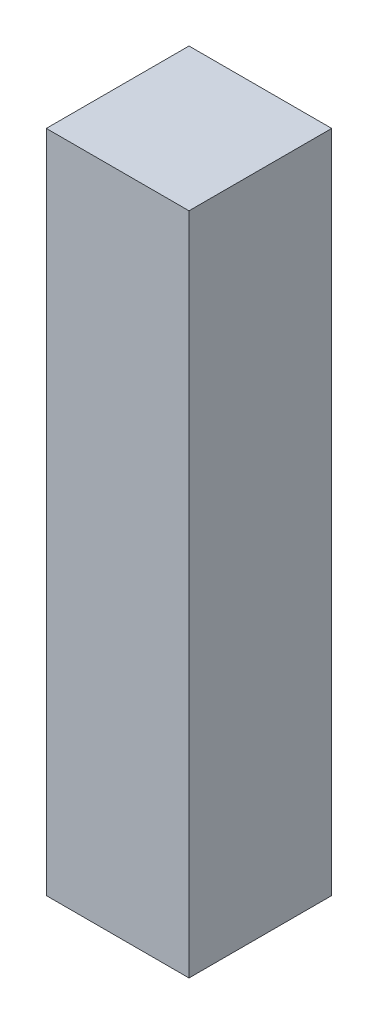
ISO-10303-21;
HEADER;
FILE_DESCRIPTION(('STEP AP214'),'2;1');
FILE_NAME('part.step','',(''),(''),'','','');
FILE_SCHEMA(('AUTOMOTIVE_DESIGN { 1 0 10303 214 1 1 1 1 }'));
ENDSEC;
DATA;
#1=APPLICATION_CONTEXT('core data for automotive mechanical design processes');
#2=APPLICATION_PROTOCOL_DEFINITION('international standard','automotive_design',2000,#1);
#3=PRODUCT_CONTEXT('',#1,'mechanical');
#4=PRODUCT('Part','Part','',(#3));
#5=PRODUCT_RELATED_PRODUCT_CATEGORY('part','',(#4));
#6=PRODUCT_DEFINITION_FORMATION('','',#4);
#7=PRODUCT_DEFINITION_CONTEXT('part definition',#1,'design');
#8=PRODUCT_DEFINITION('design','',#6,#7);
#9=PRODUCT_DEFINITION_SHAPE('','',#8);
#10=(LENGTH_UNIT() NAMED_UNIT(*) SI_UNIT(.MILLI.,.METRE.));
#11=(NAMED_UNIT(*) PLANE_ANGLE_UNIT() SI_UNIT($,.RADIAN.));
#12=(NAMED_UNIT(*) SI_UNIT($,.STERADIAN.) SOLID_ANGLE_UNIT());
#13=UNCERTAINTY_MEASURE_WITH_UNIT(LENGTH_MEASURE(1.E-05),#10,'distance_accuracy_value','');
#14=(GEOMETRIC_REPRESENTATION_CONTEXT(3) GLOBAL_UNCERTAINTY_ASSIGNED_CONTEXT((#13)) GLOBAL_UNIT_ASSIGNED_CONTEXT((#10,
#11,#12)) REPRESENTATION_CONTEXT('',''));
#15=CARTESIAN_POINT('',(0.,0.,0.));
#16=DIRECTION('',(0.,0.,1.));
#17=DIRECTION('',(1.,0.,0.));
#18=AXIS2_PLACEMENT_3D('',#15,#16,#17);
#19=CARTESIAN_POINT('',(127.5,1187.25,127.5));
#20=DIRECTION('',(-1.,0.,0.));
#21=DIRECTION('',(0.,0.,1.));
#22=AXIS2_PLACEMENT_3D('',#19,#20,#21);
#23=PLANE('',#22);
#24=DIRECTION('',(0.,0.,-1.));
#25=VECTOR('',#24,1.);
#26=CARTESIAN_POINT('',(127.5,0.,127.5));
#27=LINE('',#26,#25);
#28=CARTESIAN_POINT('',(127.5,0.,127.5));
#29=VERTEX_POINT('',#28);
#30=CARTESIAN_POINT('',(127.5,0.,-127.5));
#31=VERTEX_POINT('',#30);
#32=EDGE_CURVE('E106',#29,#31,#27,.T.);
#33=ORIENTED_EDGE('',*,*,#32,.T.);
#34=DIRECTION('',(0.,-1.,0.));
#35=VECTOR('',#34,1.);
#36=CARTESIAN_POINT('',(127.5,1187.25,-127.5));
#37=LINE('',#36,#35);
#38=CARTESIAN_POINT('',(127.5,1187.25,-127.5));
#39=VERTEX_POINT('',#38);
#40=EDGE_CURVE('E11',#39,#31,#37,.T.);
#41=ORIENTED_EDGE('',*,*,#40,.F.);
#42=DIRECTION('',(0.,0.,-1.));
#43=VECTOR('',#42,1.);
#44=CARTESIAN_POINT('',(127.5,1187.25,127.5));
#45=LINE('',#44,#43);
#46=CARTESIAN_POINT('',(127.5,1187.25,127.5));
#47=VERTEX_POINT('',#46);
#48=EDGE_CURVE('E94',#47,#39,#45,.T.);
#49=ORIENTED_EDGE('',*,*,#48,.F.);
#50=DIRECTION('',(0.,-1.,0.));
#51=VECTOR('',#50,1.);
#52=CARTESIAN_POINT('',(127.5,1187.25,127.5));
#53=LINE('',#52,#51);
#54=EDGE_CURVE('E102',#47,#29,#53,.T.);
#55=ORIENTED_EDGE('',*,*,#54,.T.);
#56=EDGE_LOOP('',(#33,#41,#49,#55));
#57=FACE_BOUND('',#56,.T.);
#58=ADVANCED_FACE('F43',(#57),#23,.F.);
#59=CARTESIAN_POINT('',(-127.5,1187.25,-127.5));
#60=DIRECTION('',(0.,0.,1.));
#61=DIRECTION('',(1.,0.,0.));
#62=AXIS2_PLACEMENT_3D('',#59,#60,#61);
#63=PLANE('',#62);
#64=DIRECTION('',(-1.,0.,0.));
#65=VECTOR('',#64,1.);
#66=CARTESIAN_POINT('',(-127.5,0.,-127.5));
#67=LINE('',#66,#65);
#68=CARTESIAN_POINT('',(-127.5,0.,-127.5));
#69=VERTEX_POINT('',#68);
#70=EDGE_CURVE('E98',#31,#69,#67,.T.);
#71=ORIENTED_EDGE('',*,*,#70,.T.);
#72=DIRECTION('',(0.,-1.,0.));
#73=VECTOR('',#72,1.);
#74=CARTESIAN_POINT('',(-127.5,1187.25,-127.5));
#75=LINE('',#74,#73);
#76=CARTESIAN_POINT('',(-127.5,1187.25,-127.5));
#77=VERTEX_POINT('',#76);
#78=EDGE_CURVE('E51',#77,#69,#75,.T.);
#79=ORIENTED_EDGE('',*,*,#78,.F.);
#80=DIRECTION('',(-1.,0.,0.));
#81=VECTOR('',#80,1.);
#82=CARTESIAN_POINT('',(-127.5,1187.25,-127.5));
#83=LINE('',#82,#81);
#84=EDGE_CURVE('E89',#39,#77,#83,.T.);
#85=ORIENTED_EDGE('',*,*,#84,.F.);
#86=ORIENTED_EDGE('',*,*,#40,.T.);
#87=EDGE_LOOP('',(#71,#79,#85,#86));
#88=FACE_BOUND('',#87,.T.);
#89=ADVANCED_FACE('F97',(#88),#63,.F.);
#90=CARTESIAN_POINT('',(-127.5,1187.25,127.5));
#91=DIRECTION('',(1.,0.,0.));
#92=DIRECTION('',(0.,0.,-1.));
#93=AXIS2_PLACEMENT_3D('',#90,#91,#92);
#94=PLANE('',#93);
#95=DIRECTION('',(0.,0.,1.));
#96=VECTOR('',#95,1.);
#97=CARTESIAN_POINT('',(-127.5,0.,127.5));
#98=LINE('',#97,#96);
#99=CARTESIAN_POINT('',(-127.5,0.,127.5));
#100=VERTEX_POINT('',#99);
#101=EDGE_CURVE('E76',#69,#100,#98,.T.);
#102=ORIENTED_EDGE('',*,*,#101,.T.);
#103=DIRECTION('',(0.,-1.,0.));
#104=VECTOR('',#103,1.);
#105=CARTESIAN_POINT('',(-127.5,1187.25,127.5));
#106=LINE('',#105,#104);
#107=CARTESIAN_POINT('',(-127.5,1187.25,127.5));
#108=VERTEX_POINT('',#107);
#109=EDGE_CURVE('E99',#108,#100,#106,.T.);
#110=ORIENTED_EDGE('',*,*,#109,.F.);
#111=DIRECTION('',(0.,0.,1.));
#112=VECTOR('',#111,1.);
#113=CARTESIAN_POINT('',(-127.5,1187.25,127.5));
#114=LINE('',#113,#112);
#115=EDGE_CURVE('E92',#77,#108,#114,.T.);
#116=ORIENTED_EDGE('',*,*,#115,.F.);
#117=ORIENTED_EDGE('',*,*,#78,.T.);
#118=EDGE_LOOP('',(#102,#110,#116,#117));
#119=FACE_BOUND('',#118,.T.);
#120=ADVANCED_FACE('F100',(#119),#94,.F.);
#121=CARTESIAN_POINT('',(-127.5,1187.25,127.5));
#122=DIRECTION('',(0.,0.,-1.));
#123=DIRECTION('',(-1.,0.,0.));
#124=AXIS2_PLACEMENT_3D('',#121,#122,#123);
#125=PLANE('',#124);
#126=DIRECTION('',(1.,0.,0.));
#127=VECTOR('',#126,1.);
#128=CARTESIAN_POINT('',(-127.5,0.,127.5));
#129=LINE('',#128,#127);
#130=EDGE_CURVE('E82',#100,#29,#129,.T.);
#131=ORIENTED_EDGE('',*,*,#130,.T.);
#132=ORIENTED_EDGE('',*,*,#54,.F.);
#133=DIRECTION('',(1.,0.,0.));
#134=VECTOR('',#133,1.);
#135=CARTESIAN_POINT('',(-127.5,1187.25,127.5));
#136=LINE('',#135,#134);
#137=EDGE_CURVE('E59',#108,#47,#136,.T.);
#138=ORIENTED_EDGE('',*,*,#137,.F.);
#139=ORIENTED_EDGE('',*,*,#109,.T.);
#140=EDGE_LOOP('',(#131,#132,#138,#139));
#141=FACE_BOUND('',#140,.T.);
#142=ADVANCED_FACE('F113',(#141),#125,.F.);
#143=CARTESIAN_POINT('',(0.,1187.25,0.));
#144=DIRECTION('',(0.,-1.,0.));
#145=DIRECTION('',(0.,0.,-1.));
#146=AXIS2_PLACEMENT_3D('',#143,#144,#145);
#147=PLANE('',#146);
#148=ORIENTED_EDGE('',*,*,#48,.T.);
#149=ORIENTED_EDGE('',*,*,#84,.T.);
#150=ORIENTED_EDGE('',*,*,#115,.T.);
#151=ORIENTED_EDGE('',*,*,#137,.T.);
#152=EDGE_LOOP('',(#148,#149,#150,#151));
#153=FACE_BOUND('',#152,.T.);
#154=ADVANCED_FACE('F90',(#153),#147,.F.);
#155=CARTESIAN_POINT('',(0.,0.,0.));
#156=DIRECTION('',(0.,-1.,0.));
#157=DIRECTION('',(0.,0.,-1.));
#158=AXIS2_PLACEMENT_3D('',#155,#156,#157);
#159=PLANE('',#158);
#160=ORIENTED_EDGE('',*,*,#32,.F.);
#161=ORIENTED_EDGE('',*,*,#130,.F.);
#162=ORIENTED_EDGE('',*,*,#101,.F.);
#163=ORIENTED_EDGE('',*,*,#70,.F.);
#164=EDGE_LOOP('',(#160,#161,#162,#163));
#165=FACE_BOUND('',#164,.T.);
#166=ADVANCED_FACE('F116',(#165),#159,.T.);
#167=CLOSED_SHELL('',(#58,#89,#120,#142,#154,#166));
#168=MANIFOLD_SOLID_BREP('B2',#167);
#169=ADVANCED_BREP_SHAPE_REPRESENTATION('',(#18,#168),#14);
#170=SHAPE_DEFINITION_REPRESENTATION(#9,#169);
ENDSEC;
END-ISO-10303-21;
